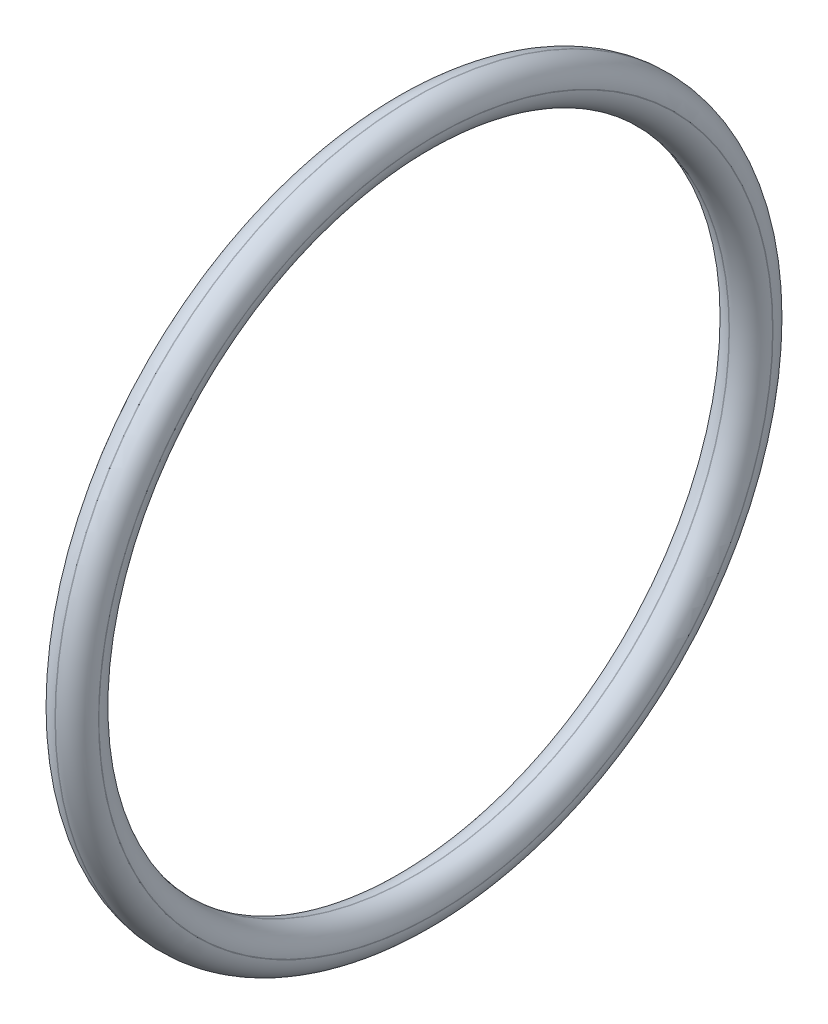
ISO-10303-21;
HEADER;
FILE_DESCRIPTION(('STEP AP214'),'2;1');
FILE_NAME('part.step','',(''),(''),'','','');
FILE_SCHEMA(('AUTOMOTIVE_DESIGN { 1 0 10303 214 1 1 1 1 }'));
ENDSEC;
DATA;
#1=APPLICATION_CONTEXT('core data for automotive mechanical design processes');
#2=APPLICATION_PROTOCOL_DEFINITION('international standard','automotive_design',2000,#1);
#3=PRODUCT_CONTEXT('',#1,'mechanical');
#4=PRODUCT('Part','Part','',(#3));
#5=PRODUCT_RELATED_PRODUCT_CATEGORY('part','',(#4));
#6=PRODUCT_DEFINITION_FORMATION('','',#4);
#7=PRODUCT_DEFINITION_CONTEXT('part definition',#1,'design');
#8=PRODUCT_DEFINITION('design','',#6,#7);
#9=PRODUCT_DEFINITION_SHAPE('','',#8);
#10=(LENGTH_UNIT() NAMED_UNIT(*) SI_UNIT(.MILLI.,.METRE.));
#11=(NAMED_UNIT(*) PLANE_ANGLE_UNIT() SI_UNIT($,.RADIAN.));
#12=(NAMED_UNIT(*) SI_UNIT($,.STERADIAN.) SOLID_ANGLE_UNIT());
#13=UNCERTAINTY_MEASURE_WITH_UNIT(LENGTH_MEASURE(1.E-05),#10,'distance_accuracy_value','');
#14=(GEOMETRIC_REPRESENTATION_CONTEXT(3) GLOBAL_UNCERTAINTY_ASSIGNED_CONTEXT((#13)) GLOBAL_UNIT_ASSIGNED_CONTEXT((#10,
#11,#12)) REPRESENTATION_CONTEXT('',''));
#15=CARTESIAN_POINT('',(0.,0.,0.));
#16=DIRECTION('',(0.,0.,1.));
#17=DIRECTION('',(1.,0.,0.));
#18=AXIS2_PLACEMENT_3D('',#15,#16,#17);
#19=CARTESIAN_POINT('',(0.85,0.,0.));
#20=DIRECTION('',(1.,0.,0.));
#21=DIRECTION('',(0.,0.,-1.));
#22=AXIS2_PLACEMENT_3D('',#19,#20,#21);
#23=PLANE('',#22);
#24=CARTESIAN_POINT('',(0.85,0.,0.));
#25=DIRECTION('',(1.,0.,0.));
#26=DIRECTION('',(0.,0.,-1.));
#27=AXIS2_PLACEMENT_3D('',#24,#25,#26);
#28=CIRCLE('',#27,6.58);
#29=CARTESIAN_POINT('',(0.85,0.,-6.58));
#30=VERTEX_POINT('',#29);
#31=EDGE_CURVE('E41',#30,#30,#28,.T.);
#32=ORIENTED_EDGE('',*,*,#31,.T.);
#33=EDGE_LOOP('',(#32));
#34=FACE_BOUND('',#33,.T.);
#35=CARTESIAN_POINT('',(0.85,0.,0.));
#36=DIRECTION('',(1.,0.,0.));
#37=DIRECTION('',(0.,0.,-1.));
#38=AXIS2_PLACEMENT_3D('',#35,#36,#37);
#39=CIRCLE('',#38,6.57);
#40=CARTESIAN_POINT('',(0.85,0.,-6.57));
#41=VERTEX_POINT('',#40);
#42=EDGE_CURVE('E45',#41,#41,#39,.F.);
#43=ORIENTED_EDGE('',*,*,#42,.T.);
#44=EDGE_LOOP('',(#43));
#45=FACE_BOUND('',#44,.T.);
#46=ADVANCED_FACE('F30',(#34,#45),#23,.T.);
#47=CARTESIAN_POINT('',(0.,0.,0.));
#48=DIRECTION('',(1.,0.,0.));
#49=DIRECTION('',(0.,0.,-1.));
#50=AXIS2_PLACEMENT_3D('',#47,#48,#49);
#51=PLANE('',#50);
#52=CARTESIAN_POINT('',(0.,0.,0.));
#53=DIRECTION('',(1.,0.,0.));
#54=DIRECTION('',(0.,0.,-1.));
#55=AXIS2_PLACEMENT_3D('',#52,#53,#54);
#56=CIRCLE('',#55,6.58);
#57=CARTESIAN_POINT('',(0.,0.,-6.58));
#58=VERTEX_POINT('',#57);
#59=EDGE_CURVE('E50',#58,#58,#56,.F.);
#60=ORIENTED_EDGE('',*,*,#59,.T.);
#61=EDGE_LOOP('',(#60));
#62=FACE_BOUND('',#61,.T.);
#63=CARTESIAN_POINT('',(0.,0.,0.));
#64=DIRECTION('',(1.,0.,0.));
#65=DIRECTION('',(0.,0.,-1.));
#66=AXIS2_PLACEMENT_3D('',#63,#64,#65);
#67=CIRCLE('',#66,6.57);
#68=CARTESIAN_POINT('',(0.,0.,-6.57));
#69=VERTEX_POINT('',#68);
#70=EDGE_CURVE('E53',#69,#69,#67,.T.);
#71=ORIENTED_EDGE('',*,*,#70,.T.);
#72=EDGE_LOOP('',(#71));
#73=FACE_BOUND('',#72,.T.);
#74=ADVANCED_FACE('F75',(#62,#73),#51,.F.);
#75=CARTESIAN_POINT('',(0.85,0.,0.));
#76=DIRECTION('',(-1.,0.,0.));
#77=DIRECTION('',(0.,0.,1.));
#78=AXIS2_PLACEMENT_3D('',#75,#76,#77);
#79=CYLINDRICAL_SURFACE('',#78,7.);
#80=CARTESIAN_POINT('',(0.42,0.,0.));
#81=DIRECTION('',(1.,0.,0.));
#82=DIRECTION('',(0.,0.,-1.));
#83=AXIS2_PLACEMENT_3D('',#80,#81,#82);
#84=CIRCLE('',#83,7.);
#85=CARTESIAN_POINT('',(0.42,0.,-7.));
#86=VERTEX_POINT('',#85);
#87=EDGE_CURVE('E56',#86,#86,#84,.T.);
#88=ORIENTED_EDGE('',*,*,#87,.T.);
#89=EDGE_LOOP('',(#88));
#90=FACE_BOUND('',#89,.T.);
#91=CARTESIAN_POINT('',(0.43,0.,0.));
#92=DIRECTION('',(1.,0.,0.));
#93=DIRECTION('',(0.,0.,-1.));
#94=AXIS2_PLACEMENT_3D('',#91,#92,#93);
#95=CIRCLE('',#94,7.);
#96=CARTESIAN_POINT('',(0.43,0.,-7.));
#97=VERTEX_POINT('',#96);
#98=EDGE_CURVE('E59',#97,#97,#95,.F.);
#99=ORIENTED_EDGE('',*,*,#98,.T.);
#100=EDGE_LOOP('',(#99));
#101=FACE_BOUND('',#100,.T.);
#102=ADVANCED_FACE('F63',(#90,#101),#79,.T.);
#103=CARTESIAN_POINT('',(0.85,0.,0.));
#104=DIRECTION('',(-1.,0.,0.));
#105=DIRECTION('',(0.,0.,1.));
#106=AXIS2_PLACEMENT_3D('',#103,#104,#105);
#107=CYLINDRICAL_SURFACE('',#106,6.15);
#108=CARTESIAN_POINT('',(0.42,0.,0.));
#109=DIRECTION('',(1.,0.,0.));
#110=DIRECTION('',(0.,0.,-1.));
#111=AXIS2_PLACEMENT_3D('',#108,#109,#110);
#112=CIRCLE('',#111,6.15);
#113=CARTESIAN_POINT('',(0.42,0.,-6.15));
#114=VERTEX_POINT('',#113);
#115=EDGE_CURVE('E10',#114,#114,#112,.F.);
#116=ORIENTED_EDGE('',*,*,#115,.T.);
#117=EDGE_LOOP('',(#116));
#118=FACE_BOUND('',#117,.T.);
#119=CARTESIAN_POINT('',(0.43,0.,0.));
#120=DIRECTION('',(1.,0.,0.));
#121=DIRECTION('',(0.,0.,-1.));
#122=AXIS2_PLACEMENT_3D('',#119,#120,#121);
#123=CIRCLE('',#122,6.15);
#124=CARTESIAN_POINT('',(0.43,0.,-6.15));
#125=VERTEX_POINT('',#124);
#126=EDGE_CURVE('E37',#125,#125,#123,.T.);
#127=ORIENTED_EDGE('',*,*,#126,.T.);
#128=EDGE_LOOP('',(#127));
#129=FACE_BOUND('',#128,.T.);
#130=ADVANCED_FACE('F91',(#118,#129),#107,.F.);
#131=CARTESIAN_POINT('',(0.42,0.,0.));
#132=DIRECTION('',(1.,0.,0.));
#133=DIRECTION('',(0.,0.,-1.));
#134=AXIS2_PLACEMENT_3D('',#131,#132,#133);
#135=TOROIDAL_SURFACE('',#134,6.58,0.42);
#136=ORIENTED_EDGE('',*,*,#59,.F.);
#137=EDGE_LOOP('',(#136));
#138=FACE_BOUND('',#137,.T.);
#139=ORIENTED_EDGE('',*,*,#87,.F.);
#140=EDGE_LOOP('',(#139));
#141=FACE_BOUND('',#140,.T.);
#142=ADVANCED_FACE('F69',(#138,#141),#135,.T.);
#143=CARTESIAN_POINT('',(0.43,0.,0.));
#144=DIRECTION('',(1.,0.,0.));
#145=DIRECTION('',(0.,0.,-1.));
#146=AXIS2_PLACEMENT_3D('',#143,#144,#145);
#147=TOROIDAL_SURFACE('',#146,6.58,0.42);
#148=ORIENTED_EDGE('',*,*,#98,.F.);
#149=EDGE_LOOP('',(#148));
#150=FACE_BOUND('',#149,.T.);
#151=ORIENTED_EDGE('',*,*,#31,.F.);
#152=EDGE_LOOP('',(#151));
#153=FACE_BOUND('',#152,.T.);
#154=ADVANCED_FACE('F65',(#150,#153),#147,.T.);
#155=CARTESIAN_POINT('',(0.42,0.,0.));
#156=DIRECTION('',(1.,0.,0.));
#157=DIRECTION('',(0.,0.,-1.));
#158=AXIS2_PLACEMENT_3D('',#155,#156,#157);
#159=TOROIDAL_SURFACE('',#158,6.57,0.42);
#160=ORIENTED_EDGE('',*,*,#115,.F.);
#161=EDGE_LOOP('',(#160));
#162=FACE_BOUND('',#161,.T.);
#163=ORIENTED_EDGE('',*,*,#70,.F.);
#164=EDGE_LOOP('',(#163));
#165=FACE_BOUND('',#164,.T.);
#166=ADVANCED_FACE('F68',(#162,#165),#159,.T.);
#167=CARTESIAN_POINT('',(0.43,0.,0.));
#168=DIRECTION('',(1.,0.,0.));
#169=DIRECTION('',(0.,0.,-1.));
#170=AXIS2_PLACEMENT_3D('',#167,#168,#169);
#171=TOROIDAL_SURFACE('',#170,6.57,0.42);
#172=ORIENTED_EDGE('',*,*,#42,.F.);
#173=EDGE_LOOP('',(#172));
#174=FACE_BOUND('',#173,.T.);
#175=ORIENTED_EDGE('',*,*,#126,.F.);
#176=EDGE_LOOP('',(#175));
#177=FACE_BOUND('',#176,.T.);
#178=ADVANCED_FACE('F32',(#174,#177),#171,.T.);
#179=CLOSED_SHELL('',(#46,#74,#102,#130,#142,#154,#166,#178));
#180=MANIFOLD_SOLID_BREP('B2',#179);
#181=ADVANCED_BREP_SHAPE_REPRESENTATION('',(#18,#180),#14);
#182=SHAPE_DEFINITION_REPRESENTATION(#9,#181);
ENDSEC;
END-ISO-10303-21;
